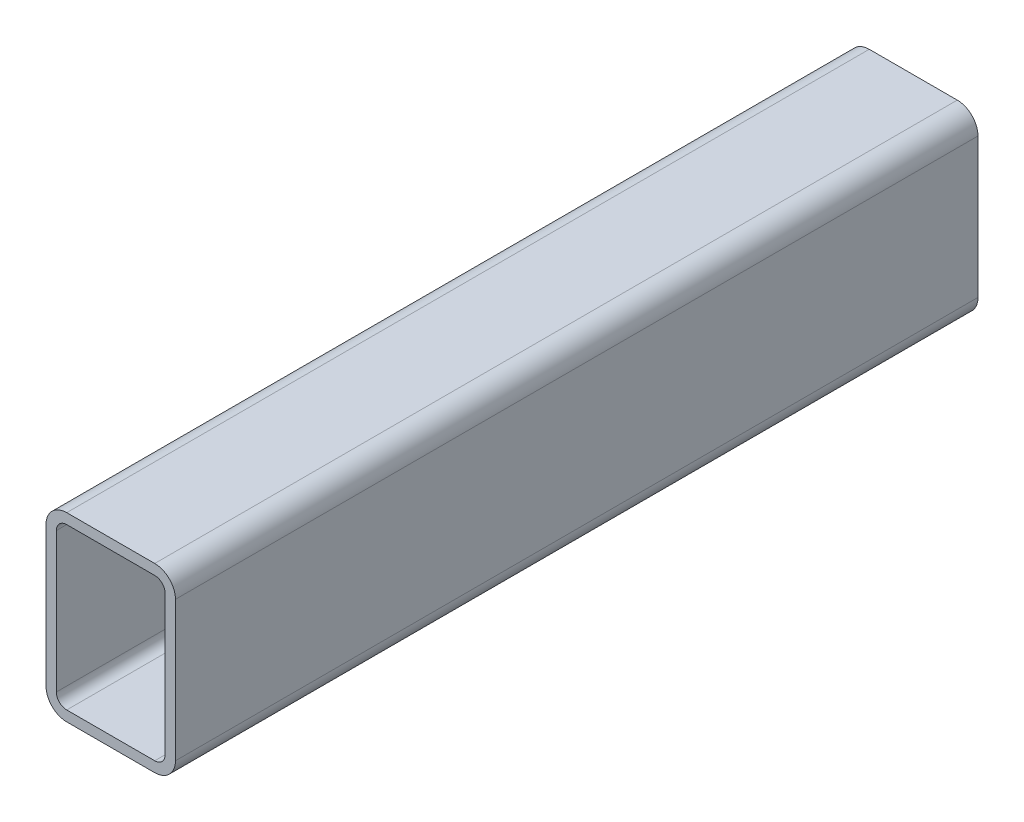
ISO-10303-21;
HEADER;
FILE_DESCRIPTION(('STEP AP214'),'2;1');
FILE_NAME('part.step','',(''),(''),'','','');
FILE_SCHEMA(('AUTOMOTIVE_DESIGN { 1 0 10303 214 1 1 1 1 }'));
ENDSEC;
DATA;
#1=APPLICATION_CONTEXT('core data for automotive mechanical design processes');
#2=APPLICATION_PROTOCOL_DEFINITION('international standard','automotive_design',2000,#1);
#3=PRODUCT_CONTEXT('',#1,'mechanical');
#4=PRODUCT('Part','Part','',(#3));
#5=PRODUCT_RELATED_PRODUCT_CATEGORY('part','',(#4));
#6=PRODUCT_DEFINITION_FORMATION('','',#4);
#7=PRODUCT_DEFINITION_CONTEXT('part definition',#1,'design');
#8=PRODUCT_DEFINITION('design','',#6,#7);
#9=PRODUCT_DEFINITION_SHAPE('','',#8);
#10=(LENGTH_UNIT() NAMED_UNIT(*) SI_UNIT(.MILLI.,.METRE.));
#11=(NAMED_UNIT(*) PLANE_ANGLE_UNIT() SI_UNIT($,.RADIAN.));
#12=(NAMED_UNIT(*) SI_UNIT($,.STERADIAN.) SOLID_ANGLE_UNIT());
#13=UNCERTAINTY_MEASURE_WITH_UNIT(LENGTH_MEASURE(1.E-05),#10,'distance_accuracy_value','');
#14=(GEOMETRIC_REPRESENTATION_CONTEXT(3) GLOBAL_UNCERTAINTY_ASSIGNED_CONTEXT((#13)) GLOBAL_UNIT_ASSIGNED_CONTEXT((#10,
#11,#12)) REPRESENTATION_CONTEXT('',''));
#15=CARTESIAN_POINT('',(0.,0.,0.));
#16=DIRECTION('',(0.,0.,1.));
#17=DIRECTION('',(1.,0.,0.));
#18=AXIS2_PLACEMENT_3D('',#15,#16,#17);
#19=CARTESIAN_POINT('',(-17.,-27.,155.));
#20=DIRECTION('',(0.,0.,1.));
#21=DIRECTION('',(1.,0.,0.));
#22=AXIS2_PLACEMENT_3D('',#19,#20,#21);
#23=PLANE('',#22);
#24=CARTESIAN_POINT('',(-17.,-27.,155.));
#25=DIRECTION('',(0.,0.,1.));
#26=DIRECTION('',(1.,0.,0.));
#27=AXIS2_PLACEMENT_3D('',#24,#25,#26);
#28=CIRCLE('',#27,8.);
#29=CARTESIAN_POINT('',(-25.,-27.,155.));
#30=VERTEX_POINT('',#29);
#31=CARTESIAN_POINT('',(-17.,-35.,155.));
#32=VERTEX_POINT('',#31);
#33=EDGE_CURVE('E212',#30,#32,#28,.T.);
#34=ORIENTED_EDGE('',*,*,#33,.T.);
#35=DIRECTION('',(1.,0.,0.));
#36=VECTOR('',#35,1.);
#37=CARTESIAN_POINT('',(-17.,-35.,155.));
#38=LINE('',#37,#36);
#39=CARTESIAN_POINT('',(17.,-35.,155.));
#40=VERTEX_POINT('',#39);
#41=EDGE_CURVE('E215',#32,#40,#38,.T.);
#42=ORIENTED_EDGE('',*,*,#41,.T.);
#43=CARTESIAN_POINT('',(17.,-27.,155.));
#44=DIRECTION('',(0.,0.,1.));
#45=DIRECTION('',(1.,0.,0.));
#46=AXIS2_PLACEMENT_3D('',#43,#44,#45);
#47=CIRCLE('',#46,8.);
#48=CARTESIAN_POINT('',(25.,-27.,155.));
#49=VERTEX_POINT('',#48);
#50=EDGE_CURVE('E218',#40,#49,#47,.T.);
#51=ORIENTED_EDGE('',*,*,#50,.T.);
#52=DIRECTION('',(0.,1.,0.));
#53=VECTOR('',#52,1.);
#54=CARTESIAN_POINT('',(25.,27.,155.));
#55=LINE('',#54,#53);
#56=CARTESIAN_POINT('',(25.,27.,155.));
#57=VERTEX_POINT('',#56);
#58=EDGE_CURVE('E220',#49,#57,#55,.T.);
#59=ORIENTED_EDGE('',*,*,#58,.T.);
#60=CARTESIAN_POINT('',(17.,27.,155.));
#61=DIRECTION('',(0.,0.,1.));
#62=DIRECTION('',(-1.,0.,0.));
#63=AXIS2_PLACEMENT_3D('',#60,#61,#62);
#64=CIRCLE('',#63,8.00000000000001);
#65=CARTESIAN_POINT('',(17.,35.,155.));
#66=VERTEX_POINT('',#65);
#67=EDGE_CURVE('E222',#57,#66,#64,.T.);
#68=ORIENTED_EDGE('',*,*,#67,.T.);
#69=DIRECTION('',(-1.,0.,0.));
#70=VECTOR('',#69,1.);
#71=CARTESIAN_POINT('',(-17.,35.,155.));
#72=LINE('',#71,#70);
#73=CARTESIAN_POINT('',(-17.,35.,155.));
#74=VERTEX_POINT('',#73);
#75=EDGE_CURVE('E224',#66,#74,#72,.T.);
#76=ORIENTED_EDGE('',*,*,#75,.T.);
#77=CARTESIAN_POINT('',(-17.,27.,155.));
#78=DIRECTION('',(0.,0.,1.));
#79=DIRECTION('',(1.,0.,0.));
#80=AXIS2_PLACEMENT_3D('',#77,#78,#79);
#81=CIRCLE('',#80,8.);
#82=CARTESIAN_POINT('',(-25.,27.,155.));
#83=VERTEX_POINT('',#82);
#84=EDGE_CURVE('E226',#74,#83,#81,.T.);
#85=ORIENTED_EDGE('',*,*,#84,.T.);
#86=DIRECTION('',(0.,-1.,0.));
#87=VECTOR('',#86,1.);
#88=CARTESIAN_POINT('',(-25.,27.,155.));
#89=LINE('',#88,#87);
#90=EDGE_CURVE('E228',#83,#30,#89,.T.);
#91=ORIENTED_EDGE('',*,*,#90,.T.);
#92=EDGE_LOOP('',(#34,#42,#51,#59,#68,#76,#85,#91));
#93=FACE_BOUND('',#92,.T.);
#94=DIRECTION('',(1.,0.,0.));
#95=VECTOR('',#94,1.);
#96=CARTESIAN_POINT('',(-17.,-31.,155.));
#97=LINE('',#96,#95);
#98=CARTESIAN_POINT('',(-17.,-31.,155.));
#99=VERTEX_POINT('',#98);
#100=CARTESIAN_POINT('',(17.,-31.,155.));
#101=VERTEX_POINT('',#100);
#102=EDGE_CURVE('E155',#99,#101,#97,.T.);
#103=ORIENTED_EDGE('',*,*,#102,.F.);
#104=CARTESIAN_POINT('',(-17.,-27.,155.));
#105=DIRECTION('',(0.,0.,1.));
#106=DIRECTION('',(-1.,0.,0.));
#107=AXIS2_PLACEMENT_3D('',#104,#105,#106);
#108=CIRCLE('',#107,4.00000000000001);
#109=CARTESIAN_POINT('',(-21.,-27.,155.));
#110=VERTEX_POINT('',#109);
#111=EDGE_CURVE('E147',#110,#99,#108,.T.);
#112=ORIENTED_EDGE('',*,*,#111,.F.);
#113=DIRECTION('',(0.,-1.,0.));
#114=VECTOR('',#113,1.);
#115=CARTESIAN_POINT('',(-21.,27.,155.));
#116=LINE('',#115,#114);
#117=CARTESIAN_POINT('',(-21.,27.,155.));
#118=VERTEX_POINT('',#117);
#119=EDGE_CURVE('E180',#118,#110,#116,.T.);
#120=ORIENTED_EDGE('',*,*,#119,.F.);
#121=CARTESIAN_POINT('',(-17.,27.,155.));
#122=DIRECTION('',(0.,0.,1.));
#123=DIRECTION('',(1.,0.,0.));
#124=AXIS2_PLACEMENT_3D('',#121,#122,#123);
#125=CIRCLE('',#124,4.00000000000001);
#126=CARTESIAN_POINT('',(-17.,31.,155.));
#127=VERTEX_POINT('',#126);
#128=EDGE_CURVE('E178',#127,#118,#125,.T.);
#129=ORIENTED_EDGE('',*,*,#128,.F.);
#130=DIRECTION('',(-1.,0.,0.));
#131=VECTOR('',#130,1.);
#132=CARTESIAN_POINT('',(-17.,31.,155.));
#133=LINE('',#132,#131);
#134=CARTESIAN_POINT('',(17.,31.,155.));
#135=VERTEX_POINT('',#134);
#136=EDGE_CURVE('E176',#135,#127,#133,.T.);
#137=ORIENTED_EDGE('',*,*,#136,.F.);
#138=CARTESIAN_POINT('',(17.,27.,155.));
#139=DIRECTION('',(0.,0.,1.));
#140=DIRECTION('',(-1.,0.,0.));
#141=AXIS2_PLACEMENT_3D('',#138,#139,#140);
#142=CIRCLE('',#141,4.00000000000001);
#143=CARTESIAN_POINT('',(21.,27.,155.));
#144=VERTEX_POINT('',#143);
#145=EDGE_CURVE('E174',#144,#135,#142,.T.);
#146=ORIENTED_EDGE('',*,*,#145,.F.);
#147=DIRECTION('',(0.,1.,0.));
#148=VECTOR('',#147,1.);
#149=CARTESIAN_POINT('',(21.,27.,155.));
#150=LINE('',#149,#148);
#151=CARTESIAN_POINT('',(21.,-27.,155.));
#152=VERTEX_POINT('',#151);
#153=EDGE_CURVE('E170',#152,#144,#150,.T.);
#154=ORIENTED_EDGE('',*,*,#153,.F.);
#155=CARTESIAN_POINT('',(17.,-27.,155.));
#156=DIRECTION('',(0.,0.,1.));
#157=DIRECTION('',(-1.,0.,0.));
#158=AXIS2_PLACEMENT_3D('',#155,#156,#157);
#159=CIRCLE('',#158,4.00000000000001);
#160=EDGE_CURVE('E168',#101,#152,#159,.T.);
#161=ORIENTED_EDGE('',*,*,#160,.F.);
#162=EDGE_LOOP('',(#103,#112,#120,#129,#137,#146,#154,#161));
#163=FACE_BOUND('',#162,.T.);
#164=ADVANCED_FACE('F34',(#93,#163),#23,.T.);
#165=CARTESIAN_POINT('',(-17.,-27.,-155.));
#166=DIRECTION('',(0.,0.,1.));
#167=DIRECTION('',(1.,0.,0.));
#168=AXIS2_PLACEMENT_3D('',#165,#166,#167);
#169=PLANE('',#168);
#170=CARTESIAN_POINT('',(-17.,-27.,-155.));
#171=DIRECTION('',(0.,0.,1.));
#172=DIRECTION('',(1.,0.,0.));
#173=AXIS2_PLACEMENT_3D('',#170,#171,#172);
#174=CIRCLE('',#173,8.);
#175=CARTESIAN_POINT('',(-25.,-27.,-155.));
#176=VERTEX_POINT('',#175);
#177=CARTESIAN_POINT('',(-17.,-35.,-155.));
#178=VERTEX_POINT('',#177);
#179=EDGE_CURVE('E163',#176,#178,#174,.T.);
#180=ORIENTED_EDGE('',*,*,#179,.F.);
#181=DIRECTION('',(0.,-1.,0.));
#182=VECTOR('',#181,1.);
#183=CARTESIAN_POINT('',(-25.,27.,-155.));
#184=LINE('',#183,#182);
#185=CARTESIAN_POINT('',(-25.,27.,-155.));
#186=VERTEX_POINT('',#185);
#187=EDGE_CURVE('E216',#186,#176,#184,.T.);
#188=ORIENTED_EDGE('',*,*,#187,.F.);
#189=CARTESIAN_POINT('',(-17.,27.,-155.));
#190=DIRECTION('',(0.,0.,1.));
#191=DIRECTION('',(1.,0.,0.));
#192=AXIS2_PLACEMENT_3D('',#189,#190,#191);
#193=CIRCLE('',#192,8.);
#194=CARTESIAN_POINT('',(-17.,35.,-155.));
#195=VERTEX_POINT('',#194);
#196=EDGE_CURVE('E243',#195,#186,#193,.T.);
#197=ORIENTED_EDGE('',*,*,#196,.F.);
#198=DIRECTION('',(-1.,0.,0.));
#199=VECTOR('',#198,1.);
#200=CARTESIAN_POINT('',(-17.,35.,-155.));
#201=LINE('',#200,#199);
#202=CARTESIAN_POINT('',(17.,35.,-155.));
#203=VERTEX_POINT('',#202);
#204=EDGE_CURVE('E241',#203,#195,#201,.T.);
#205=ORIENTED_EDGE('',*,*,#204,.F.);
#206=CARTESIAN_POINT('',(17.,27.,-155.));
#207=DIRECTION('',(0.,0.,1.));
#208=DIRECTION('',(-1.,0.,0.));
#209=AXIS2_PLACEMENT_3D('',#206,#207,#208);
#210=CIRCLE('',#209,8.00000000000001);
#211=CARTESIAN_POINT('',(25.,27.,-155.));
#212=VERTEX_POINT('',#211);
#213=EDGE_CURVE('E239',#212,#203,#210,.T.);
#214=ORIENTED_EDGE('',*,*,#213,.F.);
#215=DIRECTION('',(0.,1.,0.));
#216=VECTOR('',#215,1.);
#217=CARTESIAN_POINT('',(25.,27.,-155.));
#218=LINE('',#217,#216);
#219=CARTESIAN_POINT('',(25.,-27.,-155.));
#220=VERTEX_POINT('',#219);
#221=EDGE_CURVE('E237',#220,#212,#218,.T.);
#222=ORIENTED_EDGE('',*,*,#221,.F.);
#223=CARTESIAN_POINT('',(17.,-27.,-155.));
#224=DIRECTION('',(0.,0.,1.));
#225=DIRECTION('',(1.,0.,0.));
#226=AXIS2_PLACEMENT_3D('',#223,#224,#225);
#227=CIRCLE('',#226,8.);
#228=CARTESIAN_POINT('',(17.,-35.,-155.));
#229=VERTEX_POINT('',#228);
#230=EDGE_CURVE('E235',#229,#220,#227,.T.);
#231=ORIENTED_EDGE('',*,*,#230,.F.);
#232=DIRECTION('',(1.,0.,0.));
#233=VECTOR('',#232,1.);
#234=CARTESIAN_POINT('',(-17.,-35.,-155.));
#235=LINE('',#234,#233);
#236=EDGE_CURVE('E233',#178,#229,#235,.T.);
#237=ORIENTED_EDGE('',*,*,#236,.F.);
#238=EDGE_LOOP('',(#180,#188,#197,#205,#214,#222,#231,#237));
#239=FACE_BOUND('',#238,.T.);
#240=CARTESIAN_POINT('',(-17.,-27.,-155.));
#241=DIRECTION('',(0.,0.,1.));
#242=DIRECTION('',(-1.,0.,0.));
#243=AXIS2_PLACEMENT_3D('',#240,#241,#242);
#244=CIRCLE('',#243,4.00000000000001);
#245=CARTESIAN_POINT('',(-21.,-27.,-155.));
#246=VERTEX_POINT('',#245);
#247=CARTESIAN_POINT('',(-17.,-31.,-155.));
#248=VERTEX_POINT('',#247);
#249=EDGE_CURVE('E57',#246,#248,#244,.T.);
#250=ORIENTED_EDGE('',*,*,#249,.T.);
#251=DIRECTION('',(1.,0.,0.));
#252=VECTOR('',#251,1.);
#253=CARTESIAN_POINT('',(-17.,-31.,-155.));
#254=LINE('',#253,#252);
#255=CARTESIAN_POINT('',(17.,-31.,-155.));
#256=VERTEX_POINT('',#255);
#257=EDGE_CURVE('E162',#248,#256,#254,.T.);
#258=ORIENTED_EDGE('',*,*,#257,.T.);
#259=CARTESIAN_POINT('',(17.,-27.,-155.));
#260=DIRECTION('',(0.,0.,1.));
#261=DIRECTION('',(-1.,0.,0.));
#262=AXIS2_PLACEMENT_3D('',#259,#260,#261);
#263=CIRCLE('',#262,4.00000000000001);
#264=CARTESIAN_POINT('',(21.,-27.,-155.));
#265=VERTEX_POINT('',#264);
#266=EDGE_CURVE('E184',#256,#265,#263,.T.);
#267=ORIENTED_EDGE('',*,*,#266,.T.);
#268=DIRECTION('',(0.,1.,0.));
#269=VECTOR('',#268,1.);
#270=CARTESIAN_POINT('',(21.,27.,-155.));
#271=LINE('',#270,#269);
#272=CARTESIAN_POINT('',(21.,27.,-155.));
#273=VERTEX_POINT('',#272);
#274=EDGE_CURVE('E187',#265,#273,#271,.T.);
#275=ORIENTED_EDGE('',*,*,#274,.T.);
#276=CARTESIAN_POINT('',(17.,27.,-155.));
#277=DIRECTION('',(0.,0.,1.));
#278=DIRECTION('',(-1.,0.,0.));
#279=AXIS2_PLACEMENT_3D('',#276,#277,#278);
#280=CIRCLE('',#279,4.00000000000001);
#281=CARTESIAN_POINT('',(17.,31.,-155.));
#282=VERTEX_POINT('',#281);
#283=EDGE_CURVE('E190',#273,#282,#280,.T.);
#284=ORIENTED_EDGE('',*,*,#283,.T.);
#285=DIRECTION('',(-1.,0.,0.));
#286=VECTOR('',#285,1.);
#287=CARTESIAN_POINT('',(-17.,31.,-155.));
#288=LINE('',#287,#286);
#289=CARTESIAN_POINT('',(-17.,31.,-155.));
#290=VERTEX_POINT('',#289);
#291=EDGE_CURVE('E193',#282,#290,#288,.T.);
#292=ORIENTED_EDGE('',*,*,#291,.T.);
#293=CARTESIAN_POINT('',(-17.,27.,-155.));
#294=DIRECTION('',(0.,0.,1.));
#295=DIRECTION('',(1.,0.,0.));
#296=AXIS2_PLACEMENT_3D('',#293,#294,#295);
#297=CIRCLE('',#296,4.00000000000001);
#298=CARTESIAN_POINT('',(-21.,27.,-155.));
#299=VERTEX_POINT('',#298);
#300=EDGE_CURVE('E196',#290,#299,#297,.T.);
#301=ORIENTED_EDGE('',*,*,#300,.T.);
#302=DIRECTION('',(0.,-1.,0.));
#303=VECTOR('',#302,1.);
#304=CARTESIAN_POINT('',(-21.,27.,-155.));
#305=LINE('',#304,#303);
#306=EDGE_CURVE('E156',#299,#246,#305,.T.);
#307=ORIENTED_EDGE('',*,*,#306,.T.);
#308=EDGE_LOOP('',(#250,#258,#267,#275,#284,#292,#301,#307));
#309=FACE_BOUND('',#308,.T.);
#310=ADVANCED_FACE('F273',(#239,#309),#169,.F.);
#311=CARTESIAN_POINT('',(-17.,-27.,155.));
#312=DIRECTION('',(0.,0.,-1.));
#313=DIRECTION('',(-1.,0.,0.));
#314=AXIS2_PLACEMENT_3D('',#311,#312,#313);
#315=CYLINDRICAL_SURFACE('',#314,8.);
#316=ORIENTED_EDGE('',*,*,#179,.T.);
#317=DIRECTION('',(0.,0.,-1.));
#318=VECTOR('',#317,1.);
#319=CARTESIAN_POINT('',(-17.,-35.,155.));
#320=LINE('',#319,#318);
#321=EDGE_CURVE('E11',#32,#178,#320,.T.);
#322=ORIENTED_EDGE('',*,*,#321,.F.);
#323=ORIENTED_EDGE('',*,*,#33,.F.);
#324=DIRECTION('',(0.,0.,-1.));
#325=VECTOR('',#324,1.);
#326=CARTESIAN_POINT('',(-25.,-27.,155.));
#327=LINE('',#326,#325);
#328=EDGE_CURVE('E230',#30,#176,#327,.T.);
#329=ORIENTED_EDGE('',*,*,#328,.T.);
#330=EDGE_LOOP('',(#316,#322,#323,#329));
#331=FACE_BOUND('',#330,.T.);
#332=ADVANCED_FACE('F36',(#331),#315,.T.);
#333=CARTESIAN_POINT('',(-17.,-35.,155.));
#334=DIRECTION('',(0.,1.,0.));
#335=DIRECTION('',(-1.,0.,0.));
#336=AXIS2_PLACEMENT_3D('',#333,#334,#335);
#337=PLANE('',#336);
#338=ORIENTED_EDGE('',*,*,#236,.T.);
#339=DIRECTION('',(0.,0.,-1.));
#340=VECTOR('',#339,1.);
#341=CARTESIAN_POINT('',(17.,-35.,155.));
#342=LINE('',#341,#340);
#343=EDGE_CURVE('E42',#40,#229,#342,.T.);
#344=ORIENTED_EDGE('',*,*,#343,.F.);
#345=ORIENTED_EDGE('',*,*,#41,.F.);
#346=ORIENTED_EDGE('',*,*,#321,.T.);
#347=EDGE_LOOP('',(#338,#344,#345,#346));
#348=FACE_BOUND('',#347,.T.);
#349=ADVANCED_FACE('F290',(#348),#337,.F.);
#350=CARTESIAN_POINT('',(17.,-27.,155.));
#351=DIRECTION('',(0.,0.,-1.));
#352=DIRECTION('',(-1.,0.,0.));
#353=AXIS2_PLACEMENT_3D('',#350,#351,#352);
#354=CYLINDRICAL_SURFACE('',#353,8.);
#355=ORIENTED_EDGE('',*,*,#230,.T.);
#356=DIRECTION('',(0.,0.,-1.));
#357=VECTOR('',#356,1.);
#358=CARTESIAN_POINT('',(25.,-27.,155.));
#359=LINE('',#358,#357);
#360=EDGE_CURVE('E260',#49,#220,#359,.T.);
#361=ORIENTED_EDGE('',*,*,#360,.F.);
#362=ORIENTED_EDGE('',*,*,#50,.F.);
#363=ORIENTED_EDGE('',*,*,#343,.T.);
#364=EDGE_LOOP('',(#355,#361,#362,#363));
#365=FACE_BOUND('',#364,.T.);
#366=ADVANCED_FACE('F267',(#365),#354,.T.);
#367=CARTESIAN_POINT('',(25.,27.,155.));
#368=DIRECTION('',(-1.,0.,0.));
#369=DIRECTION('',(0.,0.,1.));
#370=AXIS2_PLACEMENT_3D('',#367,#368,#369);
#371=PLANE('',#370);
#372=ORIENTED_EDGE('',*,*,#221,.T.);
#373=DIRECTION('',(0.,0.,-1.));
#374=VECTOR('',#373,1.);
#375=CARTESIAN_POINT('',(25.,27.,155.));
#376=LINE('',#375,#374);
#377=EDGE_CURVE('E257',#57,#212,#376,.T.);
#378=ORIENTED_EDGE('',*,*,#377,.F.);
#379=ORIENTED_EDGE('',*,*,#58,.F.);
#380=ORIENTED_EDGE('',*,*,#360,.T.);
#381=EDGE_LOOP('',(#372,#378,#379,#380));
#382=FACE_BOUND('',#381,.T.);
#383=ADVANCED_FACE('F279',(#382),#371,.F.);
#384=CARTESIAN_POINT('',(17.,27.,155.));
#385=DIRECTION('',(0.,0.,-1.));
#386=DIRECTION('',(-1.,0.,0.));
#387=AXIS2_PLACEMENT_3D('',#384,#385,#386);
#388=CYLINDRICAL_SURFACE('',#387,8.00000000000001);
#389=ORIENTED_EDGE('',*,*,#213,.T.);
#390=DIRECTION('',(0.,0.,-1.));
#391=VECTOR('',#390,1.);
#392=CARTESIAN_POINT('',(17.,35.,155.));
#393=LINE('',#392,#391);
#394=EDGE_CURVE('E254',#66,#203,#393,.T.);
#395=ORIENTED_EDGE('',*,*,#394,.F.);
#396=ORIENTED_EDGE('',*,*,#67,.F.);
#397=ORIENTED_EDGE('',*,*,#377,.T.);
#398=EDGE_LOOP('',(#389,#395,#396,#397));
#399=FACE_BOUND('',#398,.T.);
#400=ADVANCED_FACE('F283',(#399),#388,.T.);
#401=CARTESIAN_POINT('',(-17.,35.,155.));
#402=DIRECTION('',(0.,-1.,0.));
#403=DIRECTION('',(1.,0.,0.));
#404=AXIS2_PLACEMENT_3D('',#401,#402,#403);
#405=PLANE('',#404);
#406=ORIENTED_EDGE('',*,*,#204,.T.);
#407=DIRECTION('',(0.,0.,-1.));
#408=VECTOR('',#407,1.);
#409=CARTESIAN_POINT('',(-17.,35.,155.));
#410=LINE('',#409,#408);
#411=EDGE_CURVE('E251',#74,#195,#410,.T.);
#412=ORIENTED_EDGE('',*,*,#411,.F.);
#413=ORIENTED_EDGE('',*,*,#75,.F.);
#414=ORIENTED_EDGE('',*,*,#394,.T.);
#415=EDGE_LOOP('',(#406,#412,#413,#414));
#416=FACE_BOUND('',#415,.T.);
#417=ADVANCED_FACE('F303',(#416),#405,.F.);
#418=CARTESIAN_POINT('',(-17.,27.,155.));
#419=DIRECTION('',(0.,0.,-1.));
#420=DIRECTION('',(-1.,0.,0.));
#421=AXIS2_PLACEMENT_3D('',#418,#419,#420);
#422=CYLINDRICAL_SURFACE('',#421,8.);
#423=ORIENTED_EDGE('',*,*,#196,.T.);
#424=DIRECTION('',(0.,0.,-1.));
#425=VECTOR('',#424,1.);
#426=CARTESIAN_POINT('',(-25.,27.,155.));
#427=LINE('',#426,#425);
#428=EDGE_CURVE('E248',#83,#186,#427,.T.);
#429=ORIENTED_EDGE('',*,*,#428,.F.);
#430=ORIENTED_EDGE('',*,*,#84,.F.);
#431=ORIENTED_EDGE('',*,*,#411,.T.);
#432=EDGE_LOOP('',(#423,#429,#430,#431));
#433=FACE_BOUND('',#432,.T.);
#434=ADVANCED_FACE('F301',(#433),#422,.T.);
#435=CARTESIAN_POINT('',(-25.,27.,155.));
#436=DIRECTION('',(1.,0.,0.));
#437=DIRECTION('',(0.,1.,0.));
#438=AXIS2_PLACEMENT_3D('',#435,#436,#437);
#439=PLANE('',#438);
#440=ORIENTED_EDGE('',*,*,#187,.T.);
#441=ORIENTED_EDGE('',*,*,#328,.F.);
#442=ORIENTED_EDGE('',*,*,#90,.F.);
#443=ORIENTED_EDGE('',*,*,#428,.T.);
#444=EDGE_LOOP('',(#440,#441,#442,#443));
#445=FACE_BOUND('',#444,.T.);
#446=ADVANCED_FACE('F296',(#445),#439,.F.);
#447=CARTESIAN_POINT('',(-17.,-27.,155.));
#448=DIRECTION('',(0.,0.,-1.));
#449=DIRECTION('',(-1.,0.,0.));
#450=AXIS2_PLACEMENT_3D('',#447,#448,#449);
#451=CYLINDRICAL_SURFACE('',#450,4.00000000000001);
#452=ORIENTED_EDGE('',*,*,#249,.F.);
#453=DIRECTION('',(0.,0.,-1.));
#454=VECTOR('',#453,1.);
#455=CARTESIAN_POINT('',(-21.,-27.,155.));
#456=LINE('',#455,#454);
#457=EDGE_CURVE('E151',#110,#246,#456,.T.);
#458=ORIENTED_EDGE('',*,*,#457,.F.);
#459=ORIENTED_EDGE('',*,*,#111,.T.);
#460=DIRECTION('',(0.,0.,-1.));
#461=VECTOR('',#460,1.);
#462=CARTESIAN_POINT('',(-17.,-31.,155.));
#463=LINE('',#462,#461);
#464=EDGE_CURVE('E150',#99,#248,#463,.T.);
#465=ORIENTED_EDGE('',*,*,#464,.T.);
#466=EDGE_LOOP('',(#452,#458,#459,#465));
#467=FACE_BOUND('',#466,.T.);
#468=ADVANCED_FACE('F149',(#467),#451,.F.);
#469=CARTESIAN_POINT('',(-17.,-31.,155.));
#470=DIRECTION('',(0.,1.,0.));
#471=DIRECTION('',(-1.,0.,0.));
#472=AXIS2_PLACEMENT_3D('',#469,#470,#471);
#473=PLANE('',#472);
#474=ORIENTED_EDGE('',*,*,#257,.F.);
#475=ORIENTED_EDGE('',*,*,#464,.F.);
#476=ORIENTED_EDGE('',*,*,#102,.T.);
#477=DIRECTION('',(0.,0.,-1.));
#478=VECTOR('',#477,1.);
#479=CARTESIAN_POINT('',(17.,-31.,155.));
#480=LINE('',#479,#478);
#481=EDGE_CURVE('E164',#101,#256,#480,.T.);
#482=ORIENTED_EDGE('',*,*,#481,.T.);
#483=EDGE_LOOP('',(#474,#475,#476,#482));
#484=FACE_BOUND('',#483,.T.);
#485=ADVANCED_FACE('F159',(#484),#473,.T.);
#486=CARTESIAN_POINT('',(17.,-27.,155.));
#487=DIRECTION('',(0.,0.,-1.));
#488=DIRECTION('',(-1.,0.,0.));
#489=AXIS2_PLACEMENT_3D('',#486,#487,#488);
#490=CYLINDRICAL_SURFACE('',#489,4.00000000000001);
#491=ORIENTED_EDGE('',*,*,#266,.F.);
#492=ORIENTED_EDGE('',*,*,#481,.F.);
#493=ORIENTED_EDGE('',*,*,#160,.T.);
#494=DIRECTION('',(0.,0.,-1.));
#495=VECTOR('',#494,1.);
#496=CARTESIAN_POINT('',(21.,-27.,155.));
#497=LINE('',#496,#495);
#498=EDGE_CURVE('E209',#152,#265,#497,.T.);
#499=ORIENTED_EDGE('',*,*,#498,.T.);
#500=EDGE_LOOP('',(#491,#492,#493,#499));
#501=FACE_BOUND('',#500,.T.);
#502=ADVANCED_FACE('F328',(#501),#490,.F.);
#503=CARTESIAN_POINT('',(21.,27.,155.));
#504=DIRECTION('',(-1.,0.,0.));
#505=DIRECTION('',(0.,0.,1.));
#506=AXIS2_PLACEMENT_3D('',#503,#504,#505);
#507=PLANE('',#506);
#508=ORIENTED_EDGE('',*,*,#274,.F.);
#509=ORIENTED_EDGE('',*,*,#498,.F.);
#510=ORIENTED_EDGE('',*,*,#153,.T.);
#511=DIRECTION('',(0.,0.,-1.));
#512=VECTOR('',#511,1.);
#513=CARTESIAN_POINT('',(21.,27.,155.));
#514=LINE('',#513,#512);
#515=EDGE_CURVE('E207',#144,#273,#514,.T.);
#516=ORIENTED_EDGE('',*,*,#515,.T.);
#517=EDGE_LOOP('',(#508,#509,#510,#516));
#518=FACE_BOUND('',#517,.T.);
#519=ADVANCED_FACE('F332',(#518),#507,.T.);
#520=CARTESIAN_POINT('',(17.,27.,155.));
#521=DIRECTION('',(0.,0.,-1.));
#522=DIRECTION('',(-1.,0.,0.));
#523=AXIS2_PLACEMENT_3D('',#520,#521,#522);
#524=CYLINDRICAL_SURFACE('',#523,4.00000000000001);
#525=ORIENTED_EDGE('',*,*,#283,.F.);
#526=ORIENTED_EDGE('',*,*,#515,.F.);
#527=ORIENTED_EDGE('',*,*,#145,.T.);
#528=DIRECTION('',(0.,0.,-1.));
#529=VECTOR('',#528,1.);
#530=CARTESIAN_POINT('',(17.,31.,155.));
#531=LINE('',#530,#529);
#532=EDGE_CURVE('E205',#135,#282,#531,.T.);
#533=ORIENTED_EDGE('',*,*,#532,.T.);
#534=EDGE_LOOP('',(#525,#526,#527,#533));
#535=FACE_BOUND('',#534,.T.);
#536=ADVANCED_FACE('F338',(#535),#524,.F.);
#537=CARTESIAN_POINT('',(-17.,31.,155.));
#538=DIRECTION('',(0.,-1.,0.));
#539=DIRECTION('',(1.,0.,0.));
#540=AXIS2_PLACEMENT_3D('',#537,#538,#539);
#541=PLANE('',#540);
#542=ORIENTED_EDGE('',*,*,#291,.F.);
#543=ORIENTED_EDGE('',*,*,#532,.F.);
#544=ORIENTED_EDGE('',*,*,#136,.T.);
#545=DIRECTION('',(0.,0.,-1.));
#546=VECTOR('',#545,1.);
#547=CARTESIAN_POINT('',(-17.,31.,155.));
#548=LINE('',#547,#546);
#549=EDGE_CURVE('E203',#127,#290,#548,.T.);
#550=ORIENTED_EDGE('',*,*,#549,.T.);
#551=EDGE_LOOP('',(#542,#543,#544,#550));
#552=FACE_BOUND('',#551,.T.);
#553=ADVANCED_FACE('F342',(#552),#541,.T.);
#554=CARTESIAN_POINT('',(-17.,27.,155.));
#555=DIRECTION('',(0.,0.,-1.));
#556=DIRECTION('',(-1.,0.,0.));
#557=AXIS2_PLACEMENT_3D('',#554,#555,#556);
#558=CYLINDRICAL_SURFACE('',#557,4.00000000000001);
#559=ORIENTED_EDGE('',*,*,#300,.F.);
#560=ORIENTED_EDGE('',*,*,#549,.F.);
#561=ORIENTED_EDGE('',*,*,#128,.T.);
#562=DIRECTION('',(0.,0.,-1.));
#563=VECTOR('',#562,1.);
#564=CARTESIAN_POINT('',(-21.,27.,155.));
#565=LINE('',#564,#563);
#566=EDGE_CURVE('E49',#118,#299,#565,.T.);
#567=ORIENTED_EDGE('',*,*,#566,.T.);
#568=EDGE_LOOP('',(#559,#560,#561,#567));
#569=FACE_BOUND('',#568,.T.);
#570=ADVANCED_FACE('F346',(#569),#558,.F.);
#571=CARTESIAN_POINT('',(-21.,27.,155.));
#572=DIRECTION('',(1.,0.,0.));
#573=DIRECTION('',(0.,1.,0.));
#574=AXIS2_PLACEMENT_3D('',#571,#572,#573);
#575=PLANE('',#574);
#576=ORIENTED_EDGE('',*,*,#306,.F.);
#577=ORIENTED_EDGE('',*,*,#566,.F.);
#578=ORIENTED_EDGE('',*,*,#119,.T.);
#579=ORIENTED_EDGE('',*,*,#457,.T.);
#580=EDGE_LOOP('',(#576,#577,#578,#579));
#581=FACE_BOUND('',#580,.T.);
#582=ADVANCED_FACE('F350',(#581),#575,.T.);
#583=CLOSED_SHELL('',(#164,#310,#332,#349,#366,#383,#400,#417,#434,#446,#468,#485,#502,#519,
#536,#553,#570,#582));
#584=MANIFOLD_SOLID_BREP('B2',#583);
#585=ADVANCED_BREP_SHAPE_REPRESENTATION('',(#18,#584),#14);
#586=SHAPE_DEFINITION_REPRESENTATION(#9,#585);
ENDSEC;
END-ISO-10303-21;
